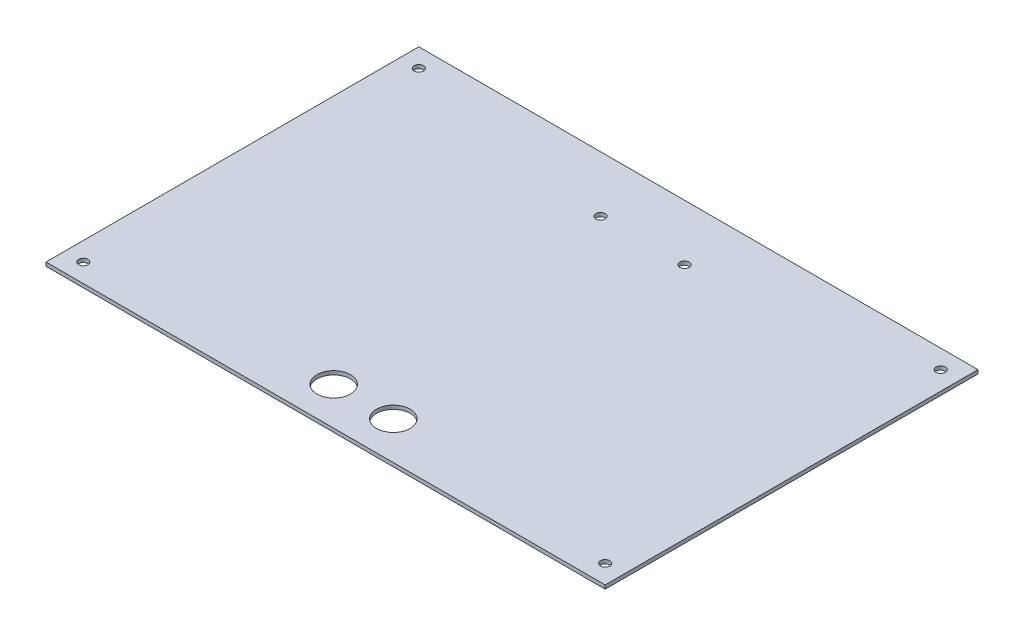
ISO-10303-21;
HEADER;
FILE_DESCRIPTION(('STEP AP214'),'2;1');
FILE_NAME('part.step','',(''),(''),'','','');
FILE_SCHEMA(('AUTOMOTIVE_DESIGN { 1 0 10303 214 1 1 1 1 }'));
ENDSEC;
DATA;
#1=APPLICATION_CONTEXT('core data for automotive mechanical design processes');
#2=APPLICATION_PROTOCOL_DEFINITION('international standard','automotive_design',2000,#1);
#3=PRODUCT_CONTEXT('',#1,'mechanical');
#4=PRODUCT('Part','Part','',(#3));
#5=PRODUCT_RELATED_PRODUCT_CATEGORY('part','',(#4));
#6=PRODUCT_DEFINITION_FORMATION('','',#4);
#7=PRODUCT_DEFINITION_CONTEXT('part definition',#1,'design');
#8=PRODUCT_DEFINITION('design','',#6,#7);
#9=PRODUCT_DEFINITION_SHAPE('','',#8);
#10=(LENGTH_UNIT() NAMED_UNIT(*) SI_UNIT(.MILLI.,.METRE.));
#11=(NAMED_UNIT(*) PLANE_ANGLE_UNIT() SI_UNIT($,.RADIAN.));
#12=(NAMED_UNIT(*) SI_UNIT($,.STERADIAN.) SOLID_ANGLE_UNIT());
#13=UNCERTAINTY_MEASURE_WITH_UNIT(LENGTH_MEASURE(1.E-05),#10,'distance_accuracy_value','');
#14=(GEOMETRIC_REPRESENTATION_CONTEXT(3) GLOBAL_UNCERTAINTY_ASSIGNED_CONTEXT((#13)) GLOBAL_UNIT_ASSIGNED_CONTEXT((#10,
#11,#12)) REPRESENTATION_CONTEXT('',''));
#15=CARTESIAN_POINT('',(0.,0.,0.));
#16=DIRECTION('',(0.,0.,1.));
#17=DIRECTION('',(1.,0.,0.));
#18=AXIS2_PLACEMENT_3D('',#15,#16,#17);
#19=CARTESIAN_POINT('',(0.,2.,0.));
#20=DIRECTION('',(0.,-1.,0.));
#21=DIRECTION('',(0.,0.,-1.));
#22=AXIS2_PLACEMENT_3D('',#19,#20,#21);
#23=PLANE('',#22);
#24=CARTESIAN_POINT('',(225.905203177465,2.,164.962969991197));
#25=DIRECTION('',(0.,1.,0.));
#26=DIRECTION('',(0.,0.,1.));
#27=AXIS2_PLACEMENT_3D('',#24,#25,#26);
#28=CIRCLE('',#27,2.5);
#29=CARTESIAN_POINT('',(225.905203177465,2.,167.462969991197));
#30=VERTEX_POINT('',#29);
#31=EDGE_CURVE('E299',#30,#30,#28,.T.);
#32=ORIENTED_EDGE('',*,*,#31,.F.);
#33=EDGE_LOOP('',(#32));
#34=FACE_BOUND('',#33,.T.);
#35=CARTESIAN_POINT('',(63.4052031774647,2.,4.96296999119714));
#36=DIRECTION('',(0.,1.,0.));
#37=DIRECTION('',(0.,0.,1.));
#38=AXIS2_PLACEMENT_3D('',#35,#36,#37);
#39=CIRCLE('',#38,2.5);
#40=CARTESIAN_POINT('',(63.4052031774647,2.,7.46296999119713));
#41=VERTEX_POINT('',#40);
#42=EDGE_CURVE('E287',#41,#41,#39,.T.);
#43=ORIENTED_EDGE('',*,*,#42,.F.);
#44=EDGE_LOOP('',(#43));
#45=FACE_BOUND('',#44,.T.);
#46=CARTESIAN_POINT('',(-54.0947968225353,2.,164.962969991197));
#47=DIRECTION('',(0.,1.,0.));
#48=DIRECTION('',(0.,0.,1.));
#49=AXIS2_PLACEMENT_3D('',#46,#47,#48);
#50=CIRCLE('',#49,2.5);
#51=CARTESIAN_POINT('',(-54.0947968225353,2.,167.462969991197));
#52=VERTEX_POINT('',#51);
#53=EDGE_CURVE('E276',#52,#52,#50,.T.);
#54=ORIENTED_EDGE('',*,*,#53,.F.);
#55=EDGE_LOOP('',(#54));
#56=FACE_BOUND('',#55,.T.);
#57=CARTESIAN_POINT('',(101.905203177465,2.,154.618414767833));
#58=DIRECTION('',(0.,1.,0.));
#59=DIRECTION('',(0.,0.,1.));
#60=AXIS2_PLACEMENT_3D('',#57,#58,#59);
#61=CIRCLE('',#60,9.);
#62=CARTESIAN_POINT('',(101.905203177465,2.,163.618414767833));
#63=VERTEX_POINT('',#62);
#64=EDGE_CURVE('E223',#63,#63,#61,.T.);
#65=ORIENTED_EDGE('',*,*,#64,.F.);
#66=EDGE_LOOP('',(#65));
#67=FACE_BOUND('',#66,.T.);
#68=DIRECTION('',(1.,0.,0.));
#69=VECTOR('',#68,1.);
#70=CARTESIAN_POINT('',(-64.0947968225353,2.,-25.0370300088029));
#71=LINE('',#70,#69);
#72=CARTESIAN_POINT('',(-64.0947968225353,2.,-25.0370300088029));
#73=VERTEX_POINT('',#72);
#74=CARTESIAN_POINT('',(235.905203177465,2.,-25.0370300088029));
#75=VERTEX_POINT('',#74);
#76=EDGE_CURVE('E213',#73,#75,#71,.T.);
#77=ORIENTED_EDGE('',*,*,#76,.F.);
#78=DIRECTION('',(0.,0.,1.));
#79=VECTOR('',#78,1.);
#80=CARTESIAN_POINT('',(-64.0947968225353,2.,-25.0370300088029));
#81=LINE('',#80,#79);
#82=CARTESIAN_POINT('',(-64.0947968225353,2.,174.962969991197));
#83=VERTEX_POINT('',#82);
#84=EDGE_CURVE('E203',#73,#83,#81,.T.);
#85=ORIENTED_EDGE('',*,*,#84,.T.);
#86=DIRECTION('',(1.,0.,0.));
#87=VECTOR('',#86,1.);
#88=CARTESIAN_POINT('',(-64.0947968225353,2.,174.962969991197));
#89=LINE('',#88,#87);
#90=CARTESIAN_POINT('',(235.905203177465,2.,174.962969991197));
#91=VERTEX_POINT('',#90);
#92=EDGE_CURVE('E198',#83,#91,#89,.T.);
#93=ORIENTED_EDGE('',*,*,#92,.T.);
#94=DIRECTION('',(0.,0.,1.));
#95=VECTOR('',#94,1.);
#96=CARTESIAN_POINT('',(235.905203177465,2.,-25.0370300088029));
#97=LINE('',#96,#95);
#98=EDGE_CURVE('E202',#75,#91,#97,.T.);
#99=ORIENTED_EDGE('',*,*,#98,.F.);
#100=EDGE_LOOP('',(#77,#85,#93,#99));
#101=FACE_BOUND('',#100,.T.);
#102=CARTESIAN_POINT('',(69.9052031774647,2.,154.618414767833));
#103=DIRECTION('',(0.,1.,0.));
#104=DIRECTION('',(0.,0.,1.));
#105=AXIS2_PLACEMENT_3D('',#102,#103,#104);
#106=CIRCLE('',#105,9.);
#107=CARTESIAN_POINT('',(69.9052031774647,2.,163.618414767833));
#108=VERTEX_POINT('',#107);
#109=EDGE_CURVE('E269',#108,#108,#106,.T.);
#110=ORIENTED_EDGE('',*,*,#109,.F.);
#111=EDGE_LOOP('',(#110));
#112=FACE_BOUND('',#111,.T.);
#113=CARTESIAN_POINT('',(-54.0947968225353,2.,-15.0370300088029));
#114=DIRECTION('',(0.,1.,0.));
#115=DIRECTION('',(0.,0.,1.));
#116=AXIS2_PLACEMENT_3D('',#113,#114,#115);
#117=CIRCLE('',#116,2.5);
#118=CARTESIAN_POINT('',(-54.0947968225353,2.,-12.5370300088029));
#119=VERTEX_POINT('',#118);
#120=EDGE_CURVE('E281',#119,#119,#117,.T.);
#121=ORIENTED_EDGE('',*,*,#120,.F.);
#122=EDGE_LOOP('',(#121));
#123=FACE_BOUND('',#122,.T.);
#124=CARTESIAN_POINT('',(108.405203177465,2.,4.96296999119714));
#125=DIRECTION('',(0.,1.,0.));
#126=DIRECTION('',(0.,0.,1.));
#127=AXIS2_PLACEMENT_3D('',#124,#125,#126);
#128=CIRCLE('',#127,2.5);
#129=CARTESIAN_POINT('',(108.405203177465,2.,7.46296999119713));
#130=VERTEX_POINT('',#129);
#131=EDGE_CURVE('E293',#130,#130,#128,.T.);
#132=ORIENTED_EDGE('',*,*,#131,.F.);
#133=EDGE_LOOP('',(#132));
#134=FACE_BOUND('',#133,.T.);
#135=CARTESIAN_POINT('',(225.905203177465,2.,-15.0370300088029));
#136=DIRECTION('',(0.,1.,0.));
#137=DIRECTION('',(0.,0.,1.));
#138=AXIS2_PLACEMENT_3D('',#135,#136,#137);
#139=CIRCLE('',#138,2.5);
#140=CARTESIAN_POINT('',(225.905203177465,2.,-12.5370300088029));
#141=VERTEX_POINT('',#140);
#142=EDGE_CURVE('E305',#141,#141,#139,.T.);
#143=ORIENTED_EDGE('',*,*,#142,.F.);
#144=EDGE_LOOP('',(#143));
#145=FACE_BOUND('',#144,.T.);
#146=ADVANCED_FACE('F152',(#34,#45,#56,#67,#101,#112,#123,#134,#145),#23,.F.);
#147=CARTESIAN_POINT('',(0.,0.,0.));
#148=DIRECTION('',(0.,-1.,0.));
#149=DIRECTION('',(0.,0.,-1.));
#150=AXIS2_PLACEMENT_3D('',#147,#148,#149);
#151=PLANE('',#150);
#152=CARTESIAN_POINT('',(225.905203177465,0.,164.962969991197));
#153=DIRECTION('',(0.,1.,0.));
#154=DIRECTION('',(0.,0.,1.));
#155=AXIS2_PLACEMENT_3D('',#152,#153,#154);
#156=CIRCLE('',#155,2.5);
#157=CARTESIAN_POINT('',(225.905203177465,0.,167.462969991197));
#158=VERTEX_POINT('',#157);
#159=EDGE_CURVE('E302',#158,#158,#156,.T.);
#160=ORIENTED_EDGE('',*,*,#159,.T.);
#161=EDGE_LOOP('',(#160));
#162=FACE_BOUND('',#161,.T.);
#163=CARTESIAN_POINT('',(63.4052031774647,0.,4.96296999119714));
#164=DIRECTION('',(0.,1.,0.));
#165=DIRECTION('',(0.,0.,1.));
#166=AXIS2_PLACEMENT_3D('',#163,#164,#165);
#167=CIRCLE('',#166,2.5);
#168=CARTESIAN_POINT('',(63.4052031774647,0.,7.46296999119713));
#169=VERTEX_POINT('',#168);
#170=EDGE_CURVE('E290',#169,#169,#167,.T.);
#171=ORIENTED_EDGE('',*,*,#170,.T.);
#172=EDGE_LOOP('',(#171));
#173=FACE_BOUND('',#172,.T.);
#174=CARTESIAN_POINT('',(-54.0947968225353,0.,164.962969991197));
#175=DIRECTION('',(0.,1.,0.));
#176=DIRECTION('',(0.,0.,1.));
#177=AXIS2_PLACEMENT_3D('',#174,#175,#176);
#178=CIRCLE('',#177,2.5);
#179=CARTESIAN_POINT('',(-54.0947968225353,0.,167.462969991197));
#180=VERTEX_POINT('',#179);
#181=EDGE_CURVE('E278',#180,#180,#178,.T.);
#182=ORIENTED_EDGE('',*,*,#181,.T.);
#183=EDGE_LOOP('',(#182));
#184=FACE_BOUND('',#183,.T.);
#185=CARTESIAN_POINT('',(101.905203177465,0.,154.618414767833));
#186=DIRECTION('',(0.,1.,0.));
#187=DIRECTION('',(0.,0.,1.));
#188=AXIS2_PLACEMENT_3D('',#185,#186,#187);
#189=CIRCLE('',#188,9.);
#190=CARTESIAN_POINT('',(101.905203177465,0.,163.618414767833));
#191=VERTEX_POINT('',#190);
#192=EDGE_CURVE('E267',#191,#191,#189,.T.);
#193=ORIENTED_EDGE('',*,*,#192,.T.);
#194=EDGE_LOOP('',(#193));
#195=FACE_BOUND('',#194,.T.);
#196=DIRECTION('',(1.,0.,0.));
#197=VECTOR('',#196,1.);
#198=CARTESIAN_POINT('',(-64.0947968225353,0.,-25.0370300088029));
#199=LINE('',#198,#197);
#200=CARTESIAN_POINT('',(-64.0947968225353,0.,-25.0370300088029));
#201=VERTEX_POINT('',#200);
#202=CARTESIAN_POINT('',(235.905203177465,0.,-25.0370300088029));
#203=VERTEX_POINT('',#202);
#204=EDGE_CURVE('E219',#201,#203,#199,.T.);
#205=ORIENTED_EDGE('',*,*,#204,.T.);
#206=DIRECTION('',(0.,0.,1.));
#207=VECTOR('',#206,1.);
#208=CARTESIAN_POINT('',(235.905203177465,0.,-25.0370300088029));
#209=LINE('',#208,#207);
#210=CARTESIAN_POINT('',(235.905203177465,0.,174.962969991197));
#211=VERTEX_POINT('',#210);
#212=EDGE_CURVE('E222',#203,#211,#209,.T.);
#213=ORIENTED_EDGE('',*,*,#212,.T.);
#214=DIRECTION('',(1.,0.,0.));
#215=VECTOR('',#214,1.);
#216=CARTESIAN_POINT('',(-64.0947968225353,0.,174.962969991197));
#217=LINE('',#216,#215);
#218=CARTESIAN_POINT('',(-64.0947968225353,0.,174.962969991197));
#219=VERTEX_POINT('',#218);
#220=EDGE_CURVE('E210',#219,#211,#217,.T.);
#221=ORIENTED_EDGE('',*,*,#220,.F.);
#222=DIRECTION('',(0.,0.,1.));
#223=VECTOR('',#222,1.);
#224=CARTESIAN_POINT('',(-64.0947968225353,0.,-25.0370300088029));
#225=LINE('',#224,#223);
#226=EDGE_CURVE('E186',#201,#219,#225,.T.);
#227=ORIENTED_EDGE('',*,*,#226,.F.);
#228=EDGE_LOOP('',(#205,#213,#221,#227));
#229=FACE_BOUND('',#228,.T.);
#230=CARTESIAN_POINT('',(69.9052031774647,0.,154.618414767833));
#231=DIRECTION('',(0.,1.,0.));
#232=DIRECTION('',(0.,0.,1.));
#233=AXIS2_PLACEMENT_3D('',#230,#231,#232);
#234=CIRCLE('',#233,9.);
#235=CARTESIAN_POINT('',(69.9052031774647,0.,163.618414767833));
#236=VERTEX_POINT('',#235);
#237=EDGE_CURVE('E272',#236,#236,#234,.T.);
#238=ORIENTED_EDGE('',*,*,#237,.T.);
#239=EDGE_LOOP('',(#238));
#240=FACE_BOUND('',#239,.T.);
#241=CARTESIAN_POINT('',(-54.0947968225353,0.,-15.0370300088029));
#242=DIRECTION('',(0.,1.,0.));
#243=DIRECTION('',(0.,0.,1.));
#244=AXIS2_PLACEMENT_3D('',#241,#242,#243);
#245=CIRCLE('',#244,2.5);
#246=CARTESIAN_POINT('',(-54.0947968225353,0.,-12.5370300088029));
#247=VERTEX_POINT('',#246);
#248=EDGE_CURVE('E284',#247,#247,#245,.T.);
#249=ORIENTED_EDGE('',*,*,#248,.T.);
#250=EDGE_LOOP('',(#249));
#251=FACE_BOUND('',#250,.T.);
#252=CARTESIAN_POINT('',(108.405203177465,0.,4.96296999119714));
#253=DIRECTION('',(0.,1.,0.));
#254=DIRECTION('',(0.,0.,1.));
#255=AXIS2_PLACEMENT_3D('',#252,#253,#254);
#256=CIRCLE('',#255,2.5);
#257=CARTESIAN_POINT('',(108.405203177465,0.,7.46296999119713));
#258=VERTEX_POINT('',#257);
#259=EDGE_CURVE('E296',#258,#258,#256,.T.);
#260=ORIENTED_EDGE('',*,*,#259,.T.);
#261=EDGE_LOOP('',(#260));
#262=FACE_BOUND('',#261,.T.);
#263=CARTESIAN_POINT('',(225.905203177465,0.,-15.0370300088029));
#264=DIRECTION('',(0.,1.,0.));
#265=DIRECTION('',(0.,0.,1.));
#266=AXIS2_PLACEMENT_3D('',#263,#264,#265);
#267=CIRCLE('',#266,2.5);
#268=CARTESIAN_POINT('',(225.905203177465,0.,-12.5370300088029));
#269=VERTEX_POINT('',#268);
#270=EDGE_CURVE('E308',#269,#269,#267,.T.);
#271=ORIENTED_EDGE('',*,*,#270,.T.);
#272=EDGE_LOOP('',(#271));
#273=FACE_BOUND('',#272,.T.);
#274=ADVANCED_FACE('F228',(#162,#173,#184,#195,#229,#240,#251,#262,#273),#151,.T.);
#275=CARTESIAN_POINT('',(-64.0947968225353,2.,-25.0370300088029));
#276=DIRECTION('',(0.,0.,-1.));
#277=DIRECTION('',(-1.,0.,0.));
#278=AXIS2_PLACEMENT_3D('',#275,#276,#277);
#279=PLANE('',#278);
#280=ORIENTED_EDGE('',*,*,#204,.F.);
#281=DIRECTION('',(0.,-1.,0.));
#282=VECTOR('',#281,1.);
#283=CARTESIAN_POINT('',(-64.0947968225353,2.,-25.0370300088029));
#284=LINE('',#283,#282);
#285=EDGE_CURVE('E12',#73,#201,#284,.T.);
#286=ORIENTED_EDGE('',*,*,#285,.F.);
#287=ORIENTED_EDGE('',*,*,#76,.T.);
#288=DIRECTION('',(0.,-1.,0.));
#289=VECTOR('',#288,1.);
#290=CARTESIAN_POINT('',(235.905203177465,2.,-25.0370300088029));
#291=LINE('',#290,#289);
#292=EDGE_CURVE('E156',#75,#203,#291,.T.);
#293=ORIENTED_EDGE('',*,*,#292,.T.);
#294=EDGE_LOOP('',(#280,#286,#287,#293));
#295=FACE_BOUND('',#294,.T.);
#296=ADVANCED_FACE('F154',(#295),#279,.T.);
#297=CARTESIAN_POINT('',(-64.0947968225353,2.,-25.0370300088029));
#298=DIRECTION('',(1.,0.,0.));
#299=DIRECTION('',(0.,0.,-1.));
#300=AXIS2_PLACEMENT_3D('',#297,#298,#299);
#301=PLANE('',#300);
#302=ORIENTED_EDGE('',*,*,#226,.T.);
#303=DIRECTION('',(0.,-1.,0.));
#304=VECTOR('',#303,1.);
#305=CARTESIAN_POINT('',(-64.0947968225353,2.,174.962969991197));
#306=LINE('',#305,#304);
#307=EDGE_CURVE('E162',#83,#219,#306,.T.);
#308=ORIENTED_EDGE('',*,*,#307,.F.);
#309=ORIENTED_EDGE('',*,*,#84,.F.);
#310=ORIENTED_EDGE('',*,*,#285,.T.);
#311=EDGE_LOOP('',(#302,#308,#309,#310));
#312=FACE_BOUND('',#311,.T.);
#313=ADVANCED_FACE('F231',(#312),#301,.F.);
#314=CARTESIAN_POINT('',(-64.0947968225353,2.,174.962969991197));
#315=DIRECTION('',(0.,0.,-1.));
#316=DIRECTION('',(-1.,0.,0.));
#317=AXIS2_PLACEMENT_3D('',#314,#315,#316);
#318=PLANE('',#317);
#319=ORIENTED_EDGE('',*,*,#220,.T.);
#320=DIRECTION('',(0.,-1.,0.));
#321=VECTOR('',#320,1.);
#322=CARTESIAN_POINT('',(235.905203177465,2.,174.962969991197));
#323=LINE('',#322,#321);
#324=EDGE_CURVE('E207',#91,#211,#323,.T.);
#325=ORIENTED_EDGE('',*,*,#324,.F.);
#326=ORIENTED_EDGE('',*,*,#92,.F.);
#327=ORIENTED_EDGE('',*,*,#307,.T.);
#328=EDGE_LOOP('',(#319,#325,#326,#327));
#329=FACE_BOUND('',#328,.T.);
#330=ADVANCED_FACE('F208',(#329),#318,.F.);
#331=CARTESIAN_POINT('',(235.905203177465,2.,-25.0370300088029));
#332=DIRECTION('',(1.,0.,0.));
#333=DIRECTION('',(0.,0.,-1.));
#334=AXIS2_PLACEMENT_3D('',#331,#332,#333);
#335=PLANE('',#334);
#336=ORIENTED_EDGE('',*,*,#212,.F.);
#337=ORIENTED_EDGE('',*,*,#292,.F.);
#338=ORIENTED_EDGE('',*,*,#98,.T.);
#339=ORIENTED_EDGE('',*,*,#324,.T.);
#340=EDGE_LOOP('',(#336,#337,#338,#339));
#341=FACE_BOUND('',#340,.T.);
#342=ADVANCED_FACE('F212',(#341),#335,.T.);
#343=CARTESIAN_POINT('',(101.905203177465,2.,154.618414767833));
#344=DIRECTION('',(0.,-1.,0.));
#345=DIRECTION('',(0.,0.,-1.));
#346=AXIS2_PLACEMENT_3D('',#343,#344,#345);
#347=CYLINDRICAL_SURFACE('',#346,9.);
#348=ORIENTED_EDGE('',*,*,#64,.T.);
#349=EDGE_LOOP('',(#348));
#350=FACE_BOUND('',#349,.T.);
#351=ORIENTED_EDGE('',*,*,#192,.F.);
#352=EDGE_LOOP('',(#351));
#353=FACE_BOUND('',#352,.T.);
#354=ADVANCED_FACE('F247',(#350,#353),#347,.F.);
#355=CARTESIAN_POINT('',(69.9052031774647,2.,154.618414767833));
#356=DIRECTION('',(0.,-1.,0.));
#357=DIRECTION('',(0.,0.,-1.));
#358=AXIS2_PLACEMENT_3D('',#355,#356,#357);
#359=CYLINDRICAL_SURFACE('',#358,9.);
#360=ORIENTED_EDGE('',*,*,#109,.T.);
#361=EDGE_LOOP('',(#360));
#362=FACE_BOUND('',#361,.T.);
#363=ORIENTED_EDGE('',*,*,#237,.F.);
#364=EDGE_LOOP('',(#363));
#365=FACE_BOUND('',#364,.T.);
#366=ADVANCED_FACE('F255',(#362,#365),#359,.F.);
#367=CARTESIAN_POINT('',(-54.0947968225353,2.,164.962969991197));
#368=DIRECTION('',(0.,-1.,0.));
#369=DIRECTION('',(0.,0.,-1.));
#370=AXIS2_PLACEMENT_3D('',#367,#368,#369);
#371=CYLINDRICAL_SURFACE('',#370,2.5);
#372=ORIENTED_EDGE('',*,*,#53,.T.);
#373=EDGE_LOOP('',(#372));
#374=FACE_BOUND('',#373,.T.);
#375=ORIENTED_EDGE('',*,*,#181,.F.);
#376=EDGE_LOOP('',(#375));
#377=FACE_BOUND('',#376,.T.);
#378=ADVANCED_FACE('F260',(#374,#377),#371,.F.);
#379=CARTESIAN_POINT('',(-54.0947968225353,2.,-15.0370300088029));
#380=DIRECTION('',(0.,-1.,0.));
#381=DIRECTION('',(0.,0.,-1.));
#382=AXIS2_PLACEMENT_3D('',#379,#380,#381);
#383=CYLINDRICAL_SURFACE('',#382,2.5);
#384=ORIENTED_EDGE('',*,*,#120,.T.);
#385=EDGE_LOOP('',(#384));
#386=FACE_BOUND('',#385,.T.);
#387=ORIENTED_EDGE('',*,*,#248,.F.);
#388=EDGE_LOOP('',(#387));
#389=FACE_BOUND('',#388,.T.);
#390=ADVANCED_FACE('F335',(#386,#389),#383,.F.);
#391=CARTESIAN_POINT('',(63.4052031774647,2.,4.96296999119714));
#392=DIRECTION('',(0.,-1.,0.));
#393=DIRECTION('',(0.,0.,-1.));
#394=AXIS2_PLACEMENT_3D('',#391,#392,#393);
#395=CYLINDRICAL_SURFACE('',#394,2.5);
#396=ORIENTED_EDGE('',*,*,#42,.T.);
#397=EDGE_LOOP('',(#396));
#398=FACE_BOUND('',#397,.T.);
#399=ORIENTED_EDGE('',*,*,#170,.F.);
#400=EDGE_LOOP('',(#399));
#401=FACE_BOUND('',#400,.T.);
#402=ADVANCED_FACE('F331',(#398,#401),#395,.F.);
#403=CARTESIAN_POINT('',(108.405203177465,2.,4.96296999119714));
#404=DIRECTION('',(0.,-1.,0.));
#405=DIRECTION('',(0.,0.,-1.));
#406=AXIS2_PLACEMENT_3D('',#403,#404,#405);
#407=CYLINDRICAL_SURFACE('',#406,2.5);
#408=ORIENTED_EDGE('',*,*,#131,.T.);
#409=EDGE_LOOP('',(#408));
#410=FACE_BOUND('',#409,.T.);
#411=ORIENTED_EDGE('',*,*,#259,.F.);
#412=EDGE_LOOP('',(#411));
#413=FACE_BOUND('',#412,.T.);
#414=ADVANCED_FACE('F325',(#410,#413),#407,.F.);
#415=CARTESIAN_POINT('',(225.905203177465,2.,164.962969991197));
#416=DIRECTION('',(0.,-1.,0.));
#417=DIRECTION('',(0.,0.,-1.));
#418=AXIS2_PLACEMENT_3D('',#415,#416,#417);
#419=CYLINDRICAL_SURFACE('',#418,2.5);
#420=ORIENTED_EDGE('',*,*,#31,.T.);
#421=EDGE_LOOP('',(#420));
#422=FACE_BOUND('',#421,.T.);
#423=ORIENTED_EDGE('',*,*,#159,.F.);
#424=EDGE_LOOP('',(#423));
#425=FACE_BOUND('',#424,.T.);
#426=ADVANCED_FACE('F318',(#422,#425),#419,.F.);
#427=CARTESIAN_POINT('',(225.905203177465,2.,-15.0370300088029));
#428=DIRECTION('',(0.,-1.,0.));
#429=DIRECTION('',(0.,0.,-1.));
#430=AXIS2_PLACEMENT_3D('',#427,#428,#429);
#431=CYLINDRICAL_SURFACE('',#430,2.5);
#432=ORIENTED_EDGE('',*,*,#142,.T.);
#433=EDGE_LOOP('',(#432));
#434=FACE_BOUND('',#433,.T.);
#435=ORIENTED_EDGE('',*,*,#270,.F.);
#436=EDGE_LOOP('',(#435));
#437=FACE_BOUND('',#436,.T.);
#438=ADVANCED_FACE('F314',(#434,#437),#431,.F.);
#439=CLOSED_SHELL('',(#146,#274,#296,#313,#330,#342,#354,#366,#378,#390,#402,#414,#426,#438));
#440=MANIFOLD_SOLID_BREP('B2',#439);
#441=ADVANCED_BREP_SHAPE_REPRESENTATION('',(#18,#440),#14);
#442=SHAPE_DEFINITION_REPRESENTATION(#9,#441);
ENDSEC;
END-ISO-10303-21;
